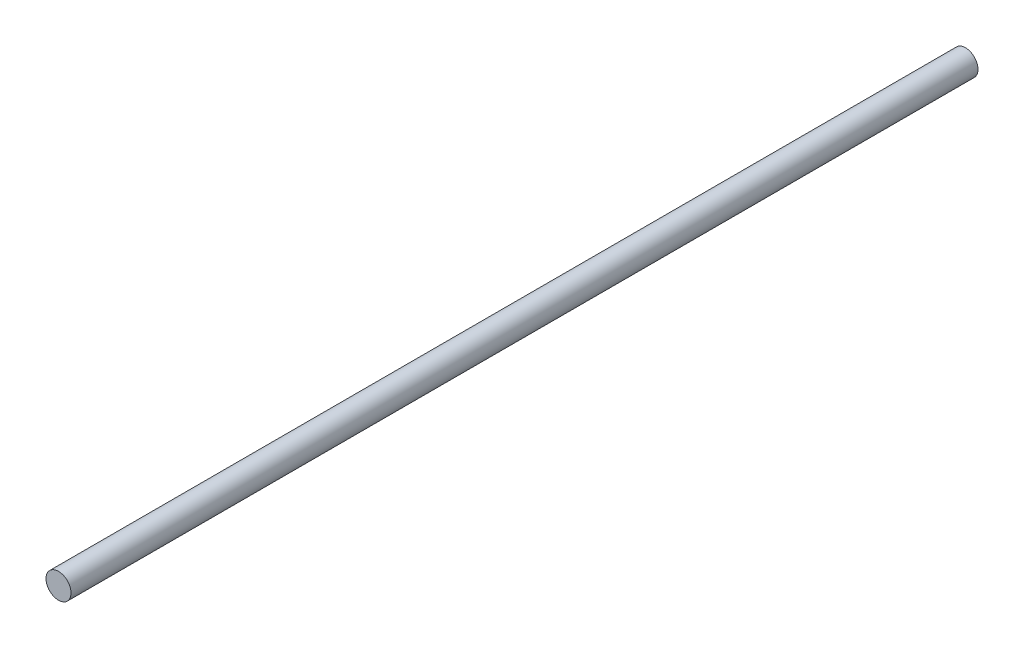
ISO-10303-21;
HEADER;
FILE_DESCRIPTION(('STEP AP214'),'2;1');
FILE_NAME('part.step','',(''),(''),'','','');
FILE_SCHEMA(('AUTOMOTIVE_DESIGN { 1 0 10303 214 1 1 1 1 }'));
ENDSEC;
DATA;
#1=APPLICATION_CONTEXT('core data for automotive mechanical design processes');
#2=APPLICATION_PROTOCOL_DEFINITION('international standard','automotive_design',2000,#1);
#3=PRODUCT_CONTEXT('',#1,'mechanical');
#4=PRODUCT('Part','Part','',(#3));
#5=PRODUCT_RELATED_PRODUCT_CATEGORY('part','',(#4));
#6=PRODUCT_DEFINITION_FORMATION('','',#4);
#7=PRODUCT_DEFINITION_CONTEXT('part definition',#1,'design');
#8=PRODUCT_DEFINITION('design','',#6,#7);
#9=PRODUCT_DEFINITION_SHAPE('','',#8);
#10=(LENGTH_UNIT() NAMED_UNIT(*) SI_UNIT(.MILLI.,.METRE.));
#11=(NAMED_UNIT(*) PLANE_ANGLE_UNIT() SI_UNIT($,.RADIAN.));
#12=(NAMED_UNIT(*) SI_UNIT($,.STERADIAN.) SOLID_ANGLE_UNIT());
#13=UNCERTAINTY_MEASURE_WITH_UNIT(LENGTH_MEASURE(1.E-05),#10,'distance_accuracy_value','');
#14=(GEOMETRIC_REPRESENTATION_CONTEXT(3) GLOBAL_UNCERTAINTY_ASSIGNED_CONTEXT((#13)) GLOBAL_UNIT_ASSIGNED_CONTEXT((#10,
#11,#12)) REPRESENTATION_CONTEXT('',''));
#15=CARTESIAN_POINT('',(0.,0.,0.));
#16=DIRECTION('',(0.,0.,1.));
#17=DIRECTION('',(1.,0.,0.));
#18=AXIS2_PLACEMENT_3D('',#15,#16,#17);
#19=CARTESIAN_POINT('',(0.,0.,-115.));
#20=DIRECTION('',(0.,0.,1.));
#21=DIRECTION('',(1.,0.,0.));
#22=AXIS2_PLACEMENT_3D('',#19,#20,#21);
#23=CYLINDRICAL_SURFACE('',#22,3.175);
#24=CARTESIAN_POINT('',(0.,0.,-115.));
#25=DIRECTION('',(0.,0.,1.));
#26=DIRECTION('',(1.,0.,0.));
#27=AXIS2_PLACEMENT_3D('',#24,#25,#26);
#28=CIRCLE('',#27,3.175);
#29=CARTESIAN_POINT('',(3.175,0.,-115.));
#30=VERTEX_POINT('',#29);
#31=EDGE_CURVE('E10',#30,#30,#28,.T.);
#32=ORIENTED_EDGE('',*,*,#31,.T.);
#33=EDGE_LOOP('',(#32));
#34=FACE_BOUND('',#33,.T.);
#35=CARTESIAN_POINT('',(0.,0.,115.));
#36=DIRECTION('',(0.,0.,1.));
#37=DIRECTION('',(1.,0.,0.));
#38=AXIS2_PLACEMENT_3D('',#35,#36,#37);
#39=CIRCLE('',#38,3.175);
#40=CARTESIAN_POINT('',(3.175,0.,115.));
#41=VERTEX_POINT('',#40);
#42=EDGE_CURVE('E38',#41,#41,#39,.T.);
#43=ORIENTED_EDGE('',*,*,#42,.F.);
#44=EDGE_LOOP('',(#43));
#45=FACE_BOUND('',#44,.T.);
#46=ADVANCED_FACE('F32',(#34,#45),#23,.T.);
#47=CARTESIAN_POINT('',(0.,0.,-115.));
#48=DIRECTION('',(0.,0.,1.));
#49=DIRECTION('',(1.,0.,0.));
#50=AXIS2_PLACEMENT_3D('',#47,#48,#49);
#51=PLANE('',#50);
#52=ORIENTED_EDGE('',*,*,#31,.F.);
#53=EDGE_LOOP('',(#52));
#54=FACE_BOUND('',#53,.T.);
#55=ADVANCED_FACE('F47',(#54),#51,.F.);
#56=CARTESIAN_POINT('',(0.,0.,115.));
#57=DIRECTION('',(0.,0.,1.));
#58=DIRECTION('',(1.,0.,0.));
#59=AXIS2_PLACEMENT_3D('',#56,#57,#58);
#60=PLANE('',#59);
#61=ORIENTED_EDGE('',*,*,#42,.T.);
#62=EDGE_LOOP('',(#61));
#63=FACE_BOUND('',#62,.T.);
#64=ADVANCED_FACE('F44',(#63),#60,.T.);
#65=CLOSED_SHELL('',(#46,#55,#64));
#66=MANIFOLD_SOLID_BREP('B2',#65);
#67=ADVANCED_BREP_SHAPE_REPRESENTATION('',(#18,#66),#14);
#68=SHAPE_DEFINITION_REPRESENTATION(#9,#67);
ENDSEC;
END-ISO-10303-21;
